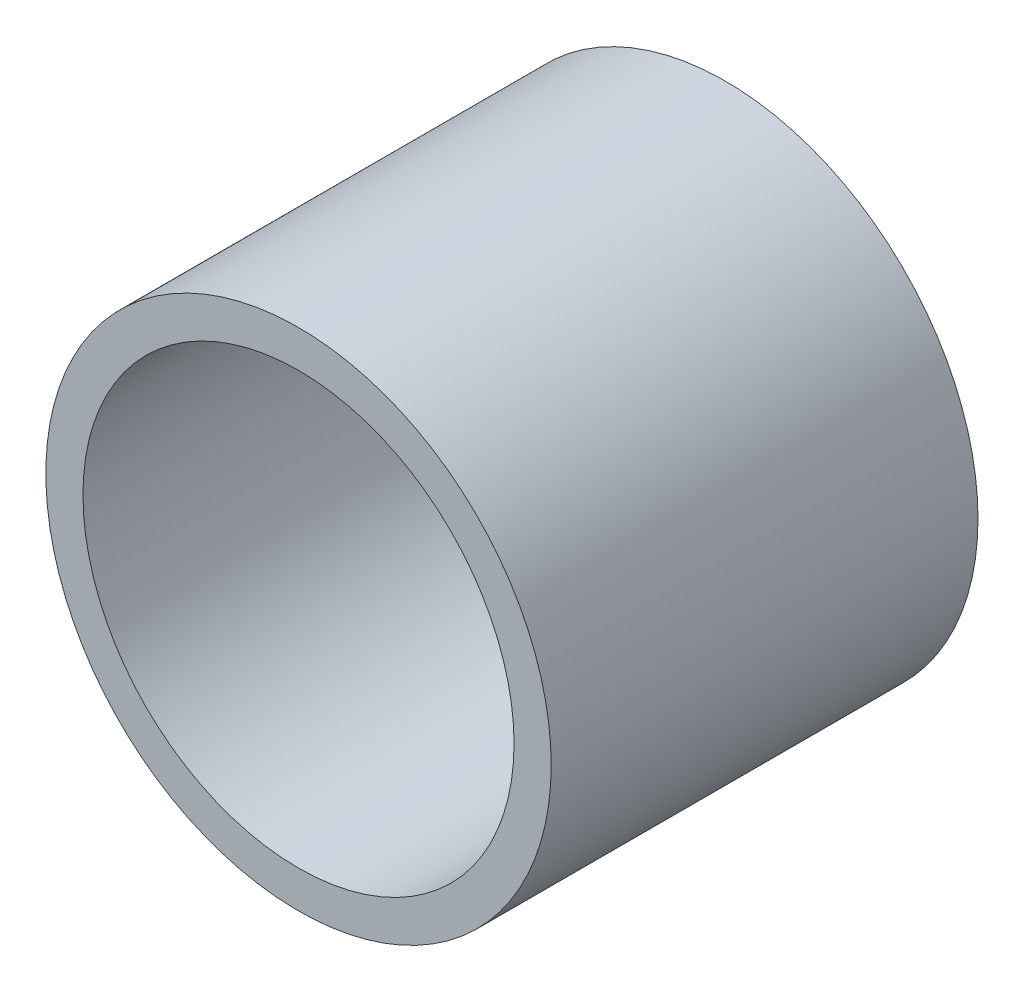
ISO-10303-21;
HEADER;
FILE_DESCRIPTION(('STEP AP214'),'2;1');
FILE_NAME('part.step','',(''),(''),'','','');
FILE_SCHEMA(('AUTOMOTIVE_DESIGN { 1 0 10303 214 1 1 1 1 }'));
ENDSEC;
DATA;
#1=APPLICATION_CONTEXT('core data for automotive mechanical design processes');
#2=APPLICATION_PROTOCOL_DEFINITION('international standard','automotive_design',2000,#1);
#3=PRODUCT_CONTEXT('',#1,'mechanical');
#4=PRODUCT('Part','Part','',(#3));
#5=PRODUCT_RELATED_PRODUCT_CATEGORY('part','',(#4));
#6=PRODUCT_DEFINITION_FORMATION('','',#4);
#7=PRODUCT_DEFINITION_CONTEXT('part definition',#1,'design');
#8=PRODUCT_DEFINITION('design','',#6,#7);
#9=PRODUCT_DEFINITION_SHAPE('','',#8);
#10=(LENGTH_UNIT() NAMED_UNIT(*) SI_UNIT(.MILLI.,.METRE.));
#11=(NAMED_UNIT(*) PLANE_ANGLE_UNIT() SI_UNIT($,.RADIAN.));
#12=(NAMED_UNIT(*) SI_UNIT($,.STERADIAN.) SOLID_ANGLE_UNIT());
#13=UNCERTAINTY_MEASURE_WITH_UNIT(LENGTH_MEASURE(1.E-05),#10,'distance_accuracy_value','');
#14=(GEOMETRIC_REPRESENTATION_CONTEXT(3) GLOBAL_UNCERTAINTY_ASSIGNED_CONTEXT((#13)) GLOBAL_UNIT_ASSIGNED_CONTEXT((#10,
#11,#12)) REPRESENTATION_CONTEXT('',''));
#15=CARTESIAN_POINT('',(0.,0.,0.));
#16=DIRECTION('',(0.,0.,1.));
#17=DIRECTION('',(1.,0.,0.));
#18=AXIS2_PLACEMENT_3D('',#15,#16,#17);
#19=CARTESIAN_POINT('',(0.,0.,-12.7));
#20=DIRECTION('',(0.,0.,1.));
#21=DIRECTION('',(1.,0.,0.));
#22=AXIS2_PLACEMENT_3D('',#19,#20,#21);
#23=CYLINDRICAL_SURFACE('',#22,6.4135);
#24=CARTESIAN_POINT('',(0.,0.,0.));
#25=DIRECTION('',(0.,0.,1.));
#26=DIRECTION('',(1.,0.,0.));
#27=AXIS2_PLACEMENT_3D('',#24,#25,#26);
#28=CIRCLE('',#27,6.4135);
#29=CARTESIAN_POINT('',(6.4135,0.,0.));
#30=VERTEX_POINT('',#29);
#31=EDGE_CURVE('E27',#30,#30,#28,.F.);
#32=ORIENTED_EDGE('',*,*,#31,.F.);
#33=EDGE_LOOP('',(#32));
#34=FACE_BOUND('',#33,.T.);
#35=CARTESIAN_POINT('',(0.,0.,-12.7));
#36=DIRECTION('',(0.,0.,1.));
#37=DIRECTION('',(1.,0.,0.));
#38=AXIS2_PLACEMENT_3D('',#35,#36,#37);
#39=CIRCLE('',#38,6.4135);
#40=CARTESIAN_POINT('',(6.4135,0.,-12.7));
#41=VERTEX_POINT('',#40);
#42=EDGE_CURVE('E18',#41,#41,#39,.T.);
#43=ORIENTED_EDGE('',*,*,#42,.F.);
#44=EDGE_LOOP('',(#43));
#45=FACE_BOUND('',#44,.T.);
#46=ADVANCED_FACE('F15',(#34,#45),#23,.F.);
#47=CARTESIAN_POINT('',(7.5184,0.,-12.7));
#48=DIRECTION('',(0.,0.,-1.));
#49=DIRECTION('',(-1.,0.,0.));
#50=AXIS2_PLACEMENT_3D('',#47,#48,#49);
#51=PLANE('',#50);
#52=CARTESIAN_POINT('',(0.,0.,-12.7));
#53=DIRECTION('',(0.,0.,1.));
#54=DIRECTION('',(1.,0.,0.));
#55=AXIS2_PLACEMENT_3D('',#52,#53,#54);
#56=CIRCLE('',#55,7.5184);
#57=CARTESIAN_POINT('',(7.5184,0.,-12.7));
#58=VERTEX_POINT('',#57);
#59=EDGE_CURVE('E22',#58,#58,#56,.T.);
#60=ORIENTED_EDGE('',*,*,#59,.F.);
#61=EDGE_LOOP('',(#60));
#62=FACE_BOUND('',#61,.T.);
#63=ORIENTED_EDGE('',*,*,#42,.T.);
#64=EDGE_LOOP('',(#63));
#65=FACE_BOUND('',#64,.T.);
#66=ADVANCED_FACE('F35',(#62,#65),#51,.T.);
#67=CARTESIAN_POINT('',(6.4135,0.,0.));
#68=DIRECTION('',(0.,0.,1.));
#69=DIRECTION('',(1.,0.,0.));
#70=AXIS2_PLACEMENT_3D('',#67,#68,#69);
#71=PLANE('',#70);
#72=ORIENTED_EDGE('',*,*,#31,.T.);
#73=EDGE_LOOP('',(#72));
#74=FACE_BOUND('',#73,.T.);
#75=CARTESIAN_POINT('',(0.,0.,0.));
#76=DIRECTION('',(0.,0.,1.));
#77=DIRECTION('',(1.,0.,0.));
#78=AXIS2_PLACEMENT_3D('',#75,#76,#77);
#79=CIRCLE('',#78,7.5184);
#80=CARTESIAN_POINT('',(7.5184,0.,0.));
#81=VERTEX_POINT('',#80);
#82=EDGE_CURVE('E10',#81,#81,#79,.F.);
#83=ORIENTED_EDGE('',*,*,#82,.F.);
#84=EDGE_LOOP('',(#83));
#85=FACE_BOUND('',#84,.T.);
#86=ADVANCED_FACE('F43',(#74,#85),#71,.T.);
#87=CARTESIAN_POINT('',(0.,0.,-12.7));
#88=DIRECTION('',(0.,0.,1.));
#89=DIRECTION('',(1.,0.,0.));
#90=AXIS2_PLACEMENT_3D('',#87,#88,#89);
#91=CYLINDRICAL_SURFACE('',#90,7.5184);
#92=ORIENTED_EDGE('',*,*,#82,.T.);
#93=EDGE_LOOP('',(#92));
#94=FACE_BOUND('',#93,.T.);
#95=ORIENTED_EDGE('',*,*,#59,.T.);
#96=EDGE_LOOP('',(#95));
#97=FACE_BOUND('',#96,.T.);
#98=ADVANCED_FACE('F45',(#94,#97),#91,.T.);
#99=CLOSED_SHELL('',(#46,#66,#86,#98));
#100=MANIFOLD_SOLID_BREP('B1',#99);
#101=ADVANCED_BREP_SHAPE_REPRESENTATION('',(#18,#100),#14);
#102=SHAPE_DEFINITION_REPRESENTATION(#9,#101);
ENDSEC;
END-ISO-10303-21;
